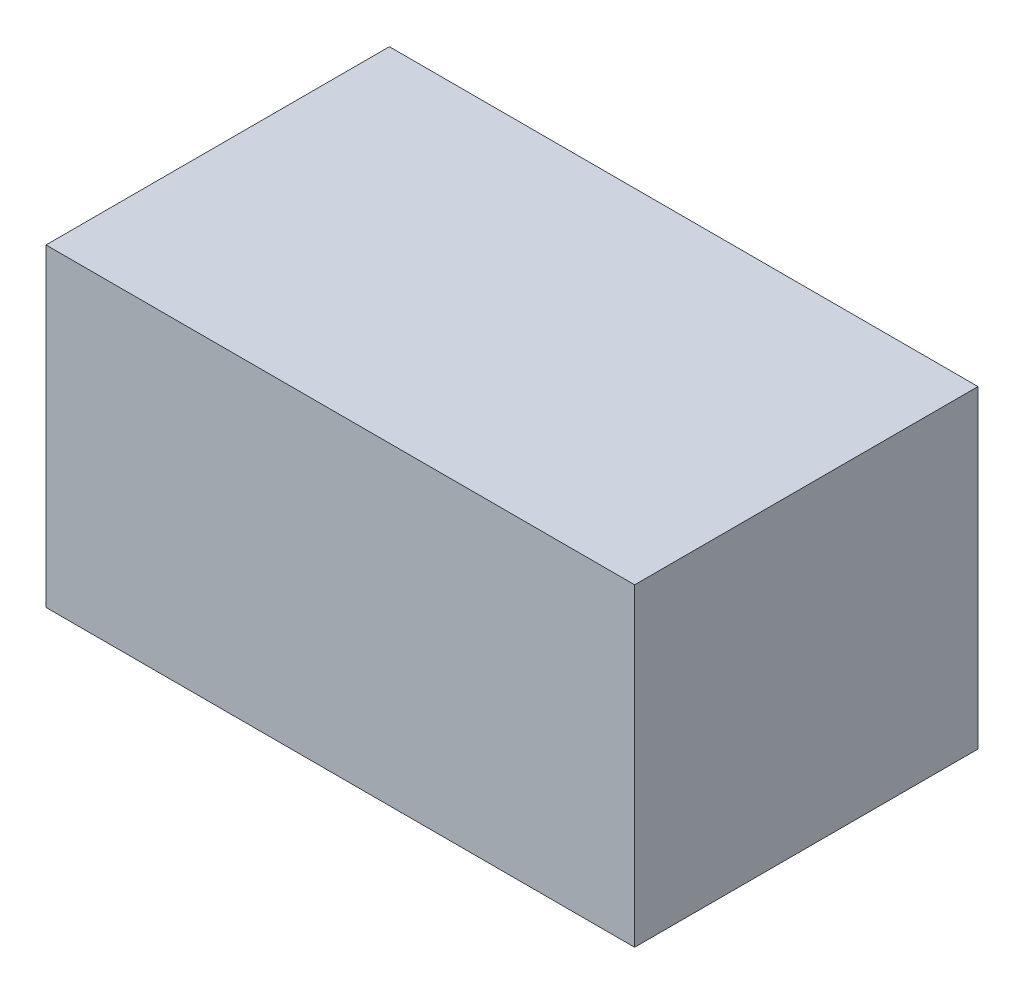
ISO-10303-21;
HEADER;
FILE_DESCRIPTION(('STEP AP214'),'2;1');
FILE_NAME('part.step','',(''),(''),'','','');
FILE_SCHEMA(('AUTOMOTIVE_DESIGN { 1 0 10303 214 1 1 1 1 }'));
ENDSEC;
DATA;
#1=APPLICATION_CONTEXT('core data for automotive mechanical design processes');
#2=APPLICATION_PROTOCOL_DEFINITION('international standard','automotive_design',2000,#1);
#3=PRODUCT_CONTEXT('',#1,'mechanical');
#4=PRODUCT('Part','Part','',(#3));
#5=PRODUCT_RELATED_PRODUCT_CATEGORY('part','',(#4));
#6=PRODUCT_DEFINITION_FORMATION('','',#4);
#7=PRODUCT_DEFINITION_CONTEXT('part definition',#1,'design');
#8=PRODUCT_DEFINITION('design','',#6,#7);
#9=PRODUCT_DEFINITION_SHAPE('','',#8);
#10=(LENGTH_UNIT() NAMED_UNIT(*) SI_UNIT(.MILLI.,.METRE.));
#11=(NAMED_UNIT(*) PLANE_ANGLE_UNIT() SI_UNIT($,.RADIAN.));
#12=(NAMED_UNIT(*) SI_UNIT($,.STERADIAN.) SOLID_ANGLE_UNIT());
#13=UNCERTAINTY_MEASURE_WITH_UNIT(LENGTH_MEASURE(1.E-05),#10,'distance_accuracy_value','');
#14=(GEOMETRIC_REPRESENTATION_CONTEXT(3) GLOBAL_UNCERTAINTY_ASSIGNED_CONTEXT((#13)) GLOBAL_UNIT_ASSIGNED_CONTEXT((#10,
#11,#12)) REPRESENTATION_CONTEXT('',''));
#15=CARTESIAN_POINT('',(0.,0.,0.));
#16=DIRECTION('',(0.,0.,1.));
#17=DIRECTION('',(1.,0.,0.));
#18=AXIS2_PLACEMENT_3D('',#15,#16,#17);
#19=CARTESIAN_POINT('',(0.,0.,10.5));
#20=DIRECTION('',(1.,0.,0.));
#21=DIRECTION('',(0.,1.,0.));
#22=AXIS2_PLACEMENT_3D('',#19,#20,#21);
#23=PLANE('',#22);
#24=DIRECTION('',(0.,-1.,0.));
#25=VECTOR('',#24,1.);
#26=CARTESIAN_POINT('',(0.,0.,0.));
#27=LINE('',#26,#25);
#28=CARTESIAN_POINT('',(0.,0.,0.));
#29=VERTEX_POINT('',#28);
#30=CARTESIAN_POINT('',(0.,-9.6,0.));
#31=VERTEX_POINT('',#30);
#32=EDGE_CURVE('E95',#29,#31,#27,.T.);
#33=ORIENTED_EDGE('',*,*,#32,.T.);
#34=DIRECTION('',(0.,0.,-1.));
#35=VECTOR('',#34,1.);
#36=CARTESIAN_POINT('',(0.,-9.6,10.5));
#37=LINE('',#36,#35);
#38=CARTESIAN_POINT('',(0.,-9.6,10.5));
#39=VERTEX_POINT('',#38);
#40=EDGE_CURVE('E11',#39,#31,#37,.T.);
#41=ORIENTED_EDGE('',*,*,#40,.F.);
#42=DIRECTION('',(0.,-1.,0.));
#43=VECTOR('',#42,1.);
#44=CARTESIAN_POINT('',(0.,0.,10.5));
#45=LINE('',#44,#43);
#46=CARTESIAN_POINT('',(0.,0.,10.5));
#47=VERTEX_POINT('',#46);
#48=EDGE_CURVE('E83',#47,#39,#45,.T.);
#49=ORIENTED_EDGE('',*,*,#48,.F.);
#50=DIRECTION('',(0.,0.,-1.));
#51=VECTOR('',#50,1.);
#52=CARTESIAN_POINT('',(0.,0.,10.5));
#53=LINE('',#52,#51);
#54=EDGE_CURVE('E91',#47,#29,#53,.T.);
#55=ORIENTED_EDGE('',*,*,#54,.T.);
#56=EDGE_LOOP('',(#33,#41,#49,#55));
#57=FACE_BOUND('',#56,.T.);
#58=ADVANCED_FACE('F32',(#57),#23,.F.);
#59=CARTESIAN_POINT('',(0.,-9.6,10.5));
#60=DIRECTION('',(0.,1.,0.));
#61=DIRECTION('',(0.,0.,1.));
#62=AXIS2_PLACEMENT_3D('',#59,#60,#61);
#63=PLANE('',#62);
#64=DIRECTION('',(1.,0.,0.));
#65=VECTOR('',#64,1.);
#66=CARTESIAN_POINT('',(0.,-9.6,0.));
#67=LINE('',#66,#65);
#68=CARTESIAN_POINT('',(18.,-9.6,0.));
#69=VERTEX_POINT('',#68);
#70=EDGE_CURVE('E87',#31,#69,#67,.T.);
#71=ORIENTED_EDGE('',*,*,#70,.T.);
#72=DIRECTION('',(0.,0.,-1.));
#73=VECTOR('',#72,1.);
#74=CARTESIAN_POINT('',(18.,-9.6,10.5));
#75=LINE('',#74,#73);
#76=CARTESIAN_POINT('',(18.,-9.6,10.5));
#77=VERTEX_POINT('',#76);
#78=EDGE_CURVE('E40',#77,#69,#75,.T.);
#79=ORIENTED_EDGE('',*,*,#78,.F.);
#80=DIRECTION('',(1.,0.,0.));
#81=VECTOR('',#80,1.);
#82=CARTESIAN_POINT('',(0.,-9.6,10.5));
#83=LINE('',#82,#81);
#84=EDGE_CURVE('E78',#39,#77,#83,.T.);
#85=ORIENTED_EDGE('',*,*,#84,.F.);
#86=ORIENTED_EDGE('',*,*,#40,.T.);
#87=EDGE_LOOP('',(#71,#79,#85,#86));
#88=FACE_BOUND('',#87,.T.);
#89=ADVANCED_FACE('F86',(#88),#63,.F.);
#90=CARTESIAN_POINT('',(18.,0.,10.5));
#91=DIRECTION('',(-1.,0.,0.));
#92=DIRECTION('',(0.,0.,1.));
#93=AXIS2_PLACEMENT_3D('',#90,#91,#92);
#94=PLANE('',#93);
#95=DIRECTION('',(0.,1.,0.));
#96=VECTOR('',#95,1.);
#97=CARTESIAN_POINT('',(18.,0.,0.));
#98=LINE('',#97,#96);
#99=CARTESIAN_POINT('',(18.,0.,0.));
#100=VERTEX_POINT('',#99);
#101=EDGE_CURVE('E65',#69,#100,#98,.T.);
#102=ORIENTED_EDGE('',*,*,#101,.T.);
#103=DIRECTION('',(0.,0.,-1.));
#104=VECTOR('',#103,1.);
#105=CARTESIAN_POINT('',(18.,0.,10.5));
#106=LINE('',#105,#104);
#107=CARTESIAN_POINT('',(18.,0.,10.5));
#108=VERTEX_POINT('',#107);
#109=EDGE_CURVE('E88',#108,#100,#106,.T.);
#110=ORIENTED_EDGE('',*,*,#109,.F.);
#111=DIRECTION('',(0.,1.,0.));
#112=VECTOR('',#111,1.);
#113=CARTESIAN_POINT('',(18.,0.,10.5));
#114=LINE('',#113,#112);
#115=EDGE_CURVE('E81',#77,#108,#114,.T.);
#116=ORIENTED_EDGE('',*,*,#115,.F.);
#117=ORIENTED_EDGE('',*,*,#78,.T.);
#118=EDGE_LOOP('',(#102,#110,#116,#117));
#119=FACE_BOUND('',#118,.T.);
#120=ADVANCED_FACE('F89',(#119),#94,.F.);
#121=CARTESIAN_POINT('',(0.,0.,10.5));
#122=DIRECTION('',(0.,-1.,0.));
#123=DIRECTION('',(0.,0.,-1.));
#124=AXIS2_PLACEMENT_3D('',#121,#122,#123);
#125=PLANE('',#124);
#126=DIRECTION('',(-1.,0.,0.));
#127=VECTOR('',#126,1.);
#128=CARTESIAN_POINT('',(0.,0.,0.));
#129=LINE('',#128,#127);
#130=EDGE_CURVE('E71',#100,#29,#129,.T.);
#131=ORIENTED_EDGE('',*,*,#130,.T.);
#132=ORIENTED_EDGE('',*,*,#54,.F.);
#133=DIRECTION('',(-1.,0.,0.));
#134=VECTOR('',#133,1.);
#135=CARTESIAN_POINT('',(0.,0.,10.5));
#136=LINE('',#135,#134);
#137=EDGE_CURVE('E48',#108,#47,#136,.T.);
#138=ORIENTED_EDGE('',*,*,#137,.F.);
#139=ORIENTED_EDGE('',*,*,#109,.T.);
#140=EDGE_LOOP('',(#131,#132,#138,#139));
#141=FACE_BOUND('',#140,.T.);
#142=ADVANCED_FACE('F102',(#141),#125,.F.);
#143=CARTESIAN_POINT('',(0.,-9.6,10.5));
#144=DIRECTION('',(0.,0.,1.));
#145=DIRECTION('',(1.,0.,0.));
#146=AXIS2_PLACEMENT_3D('',#143,#144,#145);
#147=PLANE('',#146);
#148=ORIENTED_EDGE('',*,*,#48,.T.);
#149=ORIENTED_EDGE('',*,*,#84,.T.);
#150=ORIENTED_EDGE('',*,*,#115,.T.);
#151=ORIENTED_EDGE('',*,*,#137,.T.);
#152=EDGE_LOOP('',(#148,#149,#150,#151));
#153=FACE_BOUND('',#152,.T.);
#154=ADVANCED_FACE('F79',(#153),#147,.T.);
#155=CARTESIAN_POINT('',(0.,-9.6,0.));
#156=DIRECTION('',(0.,0.,1.));
#157=DIRECTION('',(1.,0.,0.));
#158=AXIS2_PLACEMENT_3D('',#155,#156,#157);
#159=PLANE('',#158);
#160=ORIENTED_EDGE('',*,*,#32,.F.);
#161=ORIENTED_EDGE('',*,*,#130,.F.);
#162=ORIENTED_EDGE('',*,*,#101,.F.);
#163=ORIENTED_EDGE('',*,*,#70,.F.);
#164=EDGE_LOOP('',(#160,#161,#162,#163));
#165=FACE_BOUND('',#164,.T.);
#166=ADVANCED_FACE('F105',(#165),#159,.F.);
#167=CLOSED_SHELL('',(#58,#89,#120,#142,#154,#166));
#168=MANIFOLD_SOLID_BREP('B2',#167);
#169=ADVANCED_BREP_SHAPE_REPRESENTATION('',(#18,#168),#14);
#170=SHAPE_DEFINITION_REPRESENTATION(#9,#169);
ENDSEC;
END-ISO-10303-21;
